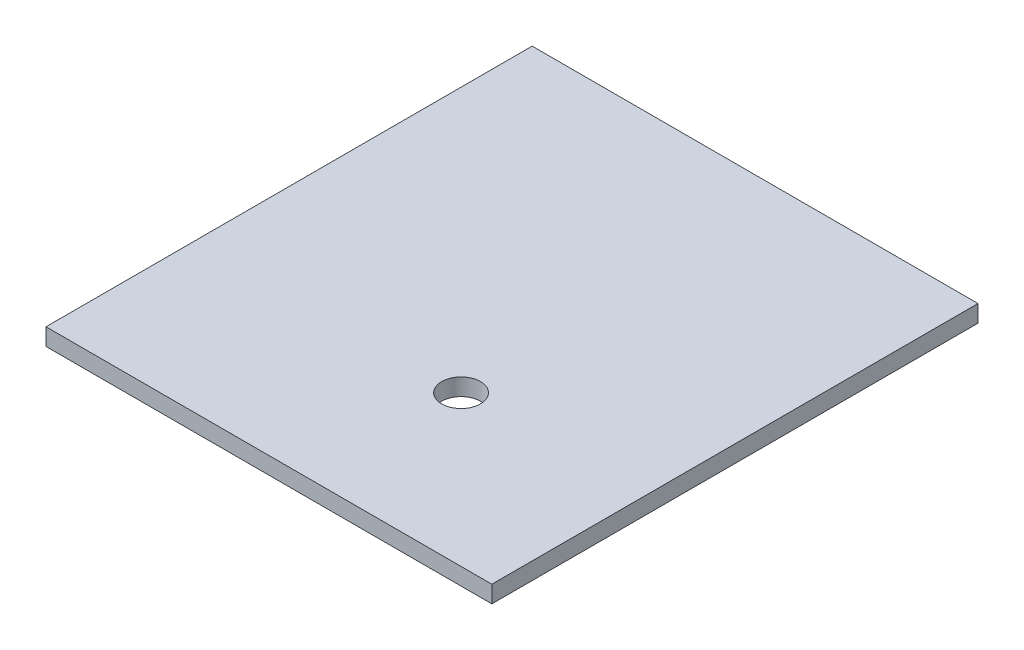
ISO-10303-21;
HEADER;
FILE_DESCRIPTION(('STEP AP214'),'2;1');
FILE_NAME('part.step','',(''),(''),'','','');
FILE_SCHEMA(('AUTOMOTIVE_DESIGN { 1 0 10303 214 1 1 1 1 }'));
ENDSEC;
DATA;
#1=APPLICATION_CONTEXT('core data for automotive mechanical design processes');
#2=APPLICATION_PROTOCOL_DEFINITION('international standard','automotive_design',2000,#1);
#3=PRODUCT_CONTEXT('',#1,'mechanical');
#4=PRODUCT('Part','Part','',(#3));
#5=PRODUCT_RELATED_PRODUCT_CATEGORY('part','',(#4));
#6=PRODUCT_DEFINITION_FORMATION('','',#4);
#7=PRODUCT_DEFINITION_CONTEXT('part definition',#1,'design');
#8=PRODUCT_DEFINITION('design','',#6,#7);
#9=PRODUCT_DEFINITION_SHAPE('','',#8);
#10=(LENGTH_UNIT() NAMED_UNIT(*) SI_UNIT(.MILLI.,.METRE.));
#11=(NAMED_UNIT(*) PLANE_ANGLE_UNIT() SI_UNIT($,.RADIAN.));
#12=(NAMED_UNIT(*) SI_UNIT($,.STERADIAN.) SOLID_ANGLE_UNIT());
#13=UNCERTAINTY_MEASURE_WITH_UNIT(LENGTH_MEASURE(1.E-05),#10,'distance_accuracy_value','');
#14=(GEOMETRIC_REPRESENTATION_CONTEXT(3) GLOBAL_UNCERTAINTY_ASSIGNED_CONTEXT((#13)) GLOBAL_UNIT_ASSIGNED_CONTEXT((#10,
#11,#12)) REPRESENTATION_CONTEXT('',''));
#15=CARTESIAN_POINT('',(0.,0.,0.));
#16=DIRECTION('',(0.,0.,1.));
#17=DIRECTION('',(1.,0.,0.));
#18=AXIS2_PLACEMENT_3D('',#15,#16,#17);
#19=CARTESIAN_POINT('',(73.025,5.588,79.629));
#20=DIRECTION('',(-1.,0.,0.));
#21=DIRECTION('',(0.,0.,1.));
#22=AXIS2_PLACEMENT_3D('',#19,#20,#21);
#23=PLANE('',#22);
#24=DIRECTION('',(0.,0.,-1.));
#25=VECTOR('',#24,1.);
#26=CARTESIAN_POINT('',(73.025,0.,79.629));
#27=LINE('',#26,#25);
#28=CARTESIAN_POINT('',(73.025,0.,79.629));
#29=VERTEX_POINT('',#28);
#30=CARTESIAN_POINT('',(73.025,0.,-79.629));
#31=VERTEX_POINT('',#30);
#32=EDGE_CURVE('E95',#29,#31,#27,.T.);
#33=ORIENTED_EDGE('',*,*,#32,.T.);
#34=DIRECTION('',(0.,-1.,0.));
#35=VECTOR('',#34,1.);
#36=CARTESIAN_POINT('',(73.025,5.588,-79.629));
#37=LINE('',#36,#35);
#38=CARTESIAN_POINT('',(73.025,5.588,-79.629));
#39=VERTEX_POINT('',#38);
#40=EDGE_CURVE('E11',#39,#31,#37,.T.);
#41=ORIENTED_EDGE('',*,*,#40,.F.);
#42=DIRECTION('',(0.,0.,-1.));
#43=VECTOR('',#42,1.);
#44=CARTESIAN_POINT('',(73.025,5.588,79.629));
#45=LINE('',#44,#43);
#46=CARTESIAN_POINT('',(73.025,5.588,79.629));
#47=VERTEX_POINT('',#46);
#48=EDGE_CURVE('E83',#47,#39,#45,.T.);
#49=ORIENTED_EDGE('',*,*,#48,.F.);
#50=DIRECTION('',(0.,-1.,0.));
#51=VECTOR('',#50,1.);
#52=CARTESIAN_POINT('',(73.025,5.588,79.629));
#53=LINE('',#52,#51);
#54=EDGE_CURVE('E91',#47,#29,#53,.T.);
#55=ORIENTED_EDGE('',*,*,#54,.T.);
#56=EDGE_LOOP('',(#33,#41,#49,#55));
#57=FACE_BOUND('',#56,.T.);
#58=ADVANCED_FACE('F32',(#57),#23,.F.);
#59=CARTESIAN_POINT('',(-73.025,5.588,-79.629));
#60=DIRECTION('',(0.,0.,1.));
#61=DIRECTION('',(1.,0.,0.));
#62=AXIS2_PLACEMENT_3D('',#59,#60,#61);
#63=PLANE('',#62);
#64=DIRECTION('',(-1.,0.,0.));
#65=VECTOR('',#64,1.);
#66=CARTESIAN_POINT('',(-73.025,0.,-79.629));
#67=LINE('',#66,#65);
#68=CARTESIAN_POINT('',(-73.025,0.,-79.629));
#69=VERTEX_POINT('',#68);
#70=EDGE_CURVE('E87',#31,#69,#67,.T.);
#71=ORIENTED_EDGE('',*,*,#70,.T.);
#72=DIRECTION('',(0.,-1.,0.));
#73=VECTOR('',#72,1.);
#74=CARTESIAN_POINT('',(-73.025,5.588,-79.629));
#75=LINE('',#74,#73);
#76=CARTESIAN_POINT('',(-73.025,5.588,-79.629));
#77=VERTEX_POINT('',#76);
#78=EDGE_CURVE('E40',#77,#69,#75,.T.);
#79=ORIENTED_EDGE('',*,*,#78,.F.);
#80=DIRECTION('',(-1.,0.,0.));
#81=VECTOR('',#80,1.);
#82=CARTESIAN_POINT('',(-73.025,5.588,-79.629));
#83=LINE('',#82,#81);
#84=EDGE_CURVE('E78',#39,#77,#83,.T.);
#85=ORIENTED_EDGE('',*,*,#84,.F.);
#86=ORIENTED_EDGE('',*,*,#40,.T.);
#87=EDGE_LOOP('',(#71,#79,#85,#86));
#88=FACE_BOUND('',#87,.T.);
#89=ADVANCED_FACE('F86',(#88),#63,.F.);
#90=CARTESIAN_POINT('',(-73.025,5.588,79.629));
#91=DIRECTION('',(1.,0.,0.));
#92=DIRECTION('',(0.,0.,-1.));
#93=AXIS2_PLACEMENT_3D('',#90,#91,#92);
#94=PLANE('',#93);
#95=DIRECTION('',(0.,0.,1.));
#96=VECTOR('',#95,1.);
#97=CARTESIAN_POINT('',(-73.025,0.,79.629));
#98=LINE('',#97,#96);
#99=CARTESIAN_POINT('',(-73.025,0.,79.629));
#100=VERTEX_POINT('',#99);
#101=EDGE_CURVE('E65',#69,#100,#98,.T.);
#102=ORIENTED_EDGE('',*,*,#101,.T.);
#103=DIRECTION('',(0.,-1.,0.));
#104=VECTOR('',#103,1.);
#105=CARTESIAN_POINT('',(-73.025,5.588,79.629));
#106=LINE('',#105,#104);
#107=CARTESIAN_POINT('',(-73.025,5.588,79.629));
#108=VERTEX_POINT('',#107);
#109=EDGE_CURVE('E88',#108,#100,#106,.T.);
#110=ORIENTED_EDGE('',*,*,#109,.F.);
#111=DIRECTION('',(0.,0.,1.));
#112=VECTOR('',#111,1.);
#113=CARTESIAN_POINT('',(-73.025,5.588,79.629));
#114=LINE('',#113,#112);
#115=EDGE_CURVE('E81',#77,#108,#114,.T.);
#116=ORIENTED_EDGE('',*,*,#115,.F.);
#117=ORIENTED_EDGE('',*,*,#78,.T.);
#118=EDGE_LOOP('',(#102,#110,#116,#117));
#119=FACE_BOUND('',#118,.T.);
#120=ADVANCED_FACE('F89',(#119),#94,.F.);
#121=CARTESIAN_POINT('',(-73.025,5.588,79.629));
#122=DIRECTION('',(0.,0.,-1.));
#123=DIRECTION('',(-1.,0.,0.));
#124=AXIS2_PLACEMENT_3D('',#121,#122,#123);
#125=PLANE('',#124);
#126=DIRECTION('',(1.,0.,0.));
#127=VECTOR('',#126,1.);
#128=CARTESIAN_POINT('',(-73.025,0.,79.629));
#129=LINE('',#128,#127);
#130=EDGE_CURVE('E71',#100,#29,#129,.T.);
#131=ORIENTED_EDGE('',*,*,#130,.T.);
#132=ORIENTED_EDGE('',*,*,#54,.F.);
#133=DIRECTION('',(1.,0.,0.));
#134=VECTOR('',#133,1.);
#135=CARTESIAN_POINT('',(-73.025,5.588,79.629));
#136=LINE('',#135,#134);
#137=EDGE_CURVE('E48',#108,#47,#136,.T.);
#138=ORIENTED_EDGE('',*,*,#137,.F.);
#139=ORIENTED_EDGE('',*,*,#109,.T.);
#140=EDGE_LOOP('',(#131,#132,#138,#139));
#141=FACE_BOUND('',#140,.T.);
#142=ADVANCED_FACE('F103',(#141),#125,.F.);
#143=CARTESIAN_POINT('',(0.,5.588,0.));
#144=DIRECTION('',(0.,-1.,0.));
#145=DIRECTION('',(0.,0.,-1.));
#146=AXIS2_PLACEMENT_3D('',#143,#144,#145);
#147=PLANE('',#146);
#148=CARTESIAN_POINT('',(13.6706470713328,5.588,30.353));
#149=DIRECTION('',(0.,1.,0.));
#150=DIRECTION('',(0.,0.,1.));
#151=AXIS2_PLACEMENT_3D('',#148,#149,#150);
#152=CIRCLE('',#151,6.35);
#153=CARTESIAN_POINT('',(13.6706470713328,5.588,36.703));
#154=VERTEX_POINT('',#153);
#155=EDGE_CURVE('E98',#154,#154,#152,.T.);
#156=ORIENTED_EDGE('',*,*,#155,.F.);
#157=EDGE_LOOP('',(#156));
#158=FACE_BOUND('',#157,.T.);
#159=ORIENTED_EDGE('',*,*,#48,.T.);
#160=ORIENTED_EDGE('',*,*,#84,.T.);
#161=ORIENTED_EDGE('',*,*,#115,.T.);
#162=ORIENTED_EDGE('',*,*,#137,.T.);
#163=EDGE_LOOP('',(#159,#160,#161,#162));
#164=FACE_BOUND('',#163,.T.);
#165=ADVANCED_FACE('F79',(#158,#164),#147,.F.);
#166=CARTESIAN_POINT('',(0.,0.,0.));
#167=DIRECTION('',(0.,-1.,0.));
#168=DIRECTION('',(0.,0.,-1.));
#169=AXIS2_PLACEMENT_3D('',#166,#167,#168);
#170=PLANE('',#169);
#171=CARTESIAN_POINT('',(13.6706470713328,0.,30.353));
#172=DIRECTION('',(0.,-1.,0.));
#173=DIRECTION('',(0.,0.,-1.));
#174=AXIS2_PLACEMENT_3D('',#171,#172,#173);
#175=CIRCLE('',#174,6.35);
#176=CARTESIAN_POINT('',(13.6706470713328,0.,36.703));
#177=VERTEX_POINT('',#176);
#178=EDGE_CURVE('E109',#177,#177,#175,.F.);
#179=ORIENTED_EDGE('',*,*,#178,.T.);
#180=EDGE_LOOP('',(#179));
#181=FACE_BOUND('',#180,.T.);
#182=ORIENTED_EDGE('',*,*,#32,.F.);
#183=ORIENTED_EDGE('',*,*,#130,.F.);
#184=ORIENTED_EDGE('',*,*,#101,.F.);
#185=ORIENTED_EDGE('',*,*,#70,.F.);
#186=EDGE_LOOP('',(#182,#183,#184,#185));
#187=FACE_BOUND('',#186,.T.);
#188=ADVANCED_FACE('F106',(#181,#187),#170,.T.);
#189=CARTESIAN_POINT('',(13.6706470713328,-0.00100000000000013,30.353));
#190=DIRECTION('',(0.,1.,0.));
#191=DIRECTION('',(0.,0.,1.));
#192=AXIS2_PLACEMENT_3D('',#189,#190,#191);
#193=CYLINDRICAL_SURFACE('',#192,6.35);
#194=CARTESIAN_POINT('',(13.6706470713328,0.,36.703));
#195=CARTESIAN_POINT('',(13.6706470713328,0.0582083333333333,36.703));
#196=CARTESIAN_POINT('',(13.6706470713328,0.116416666666667,36.703));
#197=CARTESIAN_POINT('',(13.6706470713328,0.232833333333333,36.703));
#198=CARTESIAN_POINT('',(13.6706470713328,0.291041666666667,36.703));
#199=CARTESIAN_POINT('',(13.6706470713328,0.407458333333333,36.703));
#200=CARTESIAN_POINT('',(13.6706470713328,0.465666666666667,36.703));
#201=CARTESIAN_POINT('',(13.6706470713328,0.582083333333333,36.703));
#202=CARTESIAN_POINT('',(13.6706470713328,0.640291666666667,36.703));
#203=CARTESIAN_POINT('',(13.6706470713328,0.756708333333333,36.703));
#204=CARTESIAN_POINT('',(13.6706470713328,0.814916666666667,36.703));
#205=CARTESIAN_POINT('',(13.6706470713328,0.931333333333333,36.703));
#206=CARTESIAN_POINT('',(13.6706470713328,0.989541666666667,36.703));
#207=CARTESIAN_POINT('',(13.6706470713328,1.10595833333333,36.703));
#208=CARTESIAN_POINT('',(13.6706470713328,1.16416666666667,36.703));
#209=CARTESIAN_POINT('',(13.6706470713328,1.28058333333333,36.703));
#210=CARTESIAN_POINT('',(13.6706470713328,1.33879166666667,36.703));
#211=CARTESIAN_POINT('',(13.6706470713328,1.45520833333333,36.703));
#212=CARTESIAN_POINT('',(13.6706470713328,1.51341666666667,36.703));
#213=CARTESIAN_POINT('',(13.6706470713328,1.62983333333333,36.703));
#214=CARTESIAN_POINT('',(13.6706470713328,1.68804166666667,36.703));
#215=CARTESIAN_POINT('',(13.6706470713328,1.80445833333333,36.703));
#216=CARTESIAN_POINT('',(13.6706470713328,1.86266666666667,36.703));
#217=CARTESIAN_POINT('',(13.6706470713328,1.97908333333333,36.703));
#218=CARTESIAN_POINT('',(13.6706470713328,2.03729166666667,36.703));
#219=CARTESIAN_POINT('',(13.6706470713328,2.15370833333333,36.703));
#220=CARTESIAN_POINT('',(13.6706470713328,2.21191666666667,36.703));
#221=CARTESIAN_POINT('',(13.6706470713328,2.32833333333333,36.703));
#222=CARTESIAN_POINT('',(13.6706470713328,2.38654166666667,36.703));
#223=CARTESIAN_POINT('',(13.6706470713328,2.50295833333333,36.703));
#224=CARTESIAN_POINT('',(13.6706470713328,2.56116666666667,36.703));
#225=CARTESIAN_POINT('',(13.6706470713328,2.67758333333333,36.703));
#226=CARTESIAN_POINT('',(13.6706470713328,2.73579166666667,36.703));
#227=CARTESIAN_POINT('',(13.6706470713328,2.85220833333333,36.703));
#228=CARTESIAN_POINT('',(13.6706470713328,2.91041666666667,36.703));
#229=CARTESIAN_POINT('',(13.6706470713328,3.02683333333333,36.703));
#230=CARTESIAN_POINT('',(13.6706470713328,3.08504166666667,36.703));
#231=CARTESIAN_POINT('',(13.6706470713328,3.20145833333333,36.703));
#232=CARTESIAN_POINT('',(13.6706470713328,3.25966666666667,36.703));
#233=CARTESIAN_POINT('',(13.6706470713328,3.37608333333333,36.703));
#234=CARTESIAN_POINT('',(13.6706470713328,3.43429166666667,36.703));
#235=CARTESIAN_POINT('',(13.6706470713328,3.55070833333333,36.703));
#236=CARTESIAN_POINT('',(13.6706470713328,3.60891666666667,36.703));
#237=CARTESIAN_POINT('',(13.6706470713328,3.72533333333333,36.703));
#238=CARTESIAN_POINT('',(13.6706470713328,3.78354166666667,36.703));
#239=CARTESIAN_POINT('',(13.6706470713328,3.89995833333333,36.703));
#240=CARTESIAN_POINT('',(13.6706470713328,3.95816666666667,36.703));
#241=CARTESIAN_POINT('',(13.6706470713328,4.07458333333333,36.703));
#242=CARTESIAN_POINT('',(13.6706470713328,4.13279166666667,36.703));
#243=CARTESIAN_POINT('',(13.6706470713328,4.24920833333333,36.703));
#244=CARTESIAN_POINT('',(13.6706470713328,4.30741666666667,36.703));
#245=CARTESIAN_POINT('',(13.6706470713328,4.42383333333333,36.703));
#246=CARTESIAN_POINT('',(13.6706470713328,4.48204166666667,36.703));
#247=CARTESIAN_POINT('',(13.6706470713328,4.59845833333333,36.703));
#248=CARTESIAN_POINT('',(13.6706470713328,4.65666666666667,36.703));
#249=CARTESIAN_POINT('',(13.6706470713328,4.77308333333333,36.703));
#250=CARTESIAN_POINT('',(13.6706470713328,4.83129166666667,36.703));
#251=CARTESIAN_POINT('',(13.6706470713328,4.94770833333333,36.703));
#252=CARTESIAN_POINT('',(13.6706470713328,5.00591666666667,36.703));
#253=CARTESIAN_POINT('',(13.6706470713328,5.12233333333333,36.703));
#254=CARTESIAN_POINT('',(13.6706470713328,5.18054166666667,36.703));
#255=CARTESIAN_POINT('',(13.6706470713328,5.29695833333333,36.703));
#256=CARTESIAN_POINT('',(13.6706470713328,5.35516666666667,36.703));
#257=CARTESIAN_POINT('',(13.6706470713328,5.47158333333333,36.703));
#258=CARTESIAN_POINT('',(13.6706470713328,5.52979166666667,36.703));
#259=CARTESIAN_POINT('',(13.6706470713328,5.588,36.703));
#260=B_SPLINE_CURVE_WITH_KNOTS('',3,(#194,#195,#196,#197,#198,#199,#200,#201,#202,#203,#204,
#205,#206,#207,#208,#209,#210,#211,#212,#213,#214,#215,#216,#217,#218,#219,#220,#221,#222,#223,
#224,#225,#226,#227,#228,#229,#230,#231,#232,#233,#234,#235,#236,#237,#238,#239,#240,#241,#242,
#243,#244,#245,#246,#247,#248,#249,#250,#251,#252,#253,#254,#255,#256,#257,#258,#259),
.UNSPECIFIED.,.F.,.F.,(4,2,2,2,2,2,2,2,2,2,2,2,2,2,2,2,2,2,2,2,2,2,2,2,2,2,2,2,2,2,2,2,4),(0.,
0.174625,0.34925,0.523875,0.6985,0.873125,1.04775,1.222375,1.397,1.571625,1.74625,1.920875,
2.0955,2.270125,2.44475,2.619375,2.794,2.968625,3.14325,3.317875,3.4925,3.667125,3.84175,
4.016375,4.191,4.365625,4.54025,4.714875,4.8895,5.064125,5.23875,5.413375,5.588),.UNSPECIFIED.);
#261=EDGE_CURVE('BSEAM115',#177,#154,#260,.T.);
#262=ORIENTED_EDGE('',*,*,#178,.F.);
#263=ORIENTED_EDGE('',*,*,#155,.T.);
#264=ORIENTED_EDGE('',*,*,#261,.T.);
#265=ORIENTED_EDGE('',*,*,#261,.F.);
#266=EDGE_LOOP('',(#262,#264,#263,#265));
#267=FACE_BOUND('',#266,.T.);
#268=ADVANCED_FACE('F115',(#267),#193,.F.);
#269=CLOSED_SHELL('',(#58,#89,#120,#142,#165,#188,#268));
#270=MANIFOLD_SOLID_BREP('B2',#269);
#271=ADVANCED_BREP_SHAPE_REPRESENTATION('',(#18,#270),#14);
#272=SHAPE_DEFINITION_REPRESENTATION(#9,#271);
ENDSEC;
END-ISO-10303-21;
